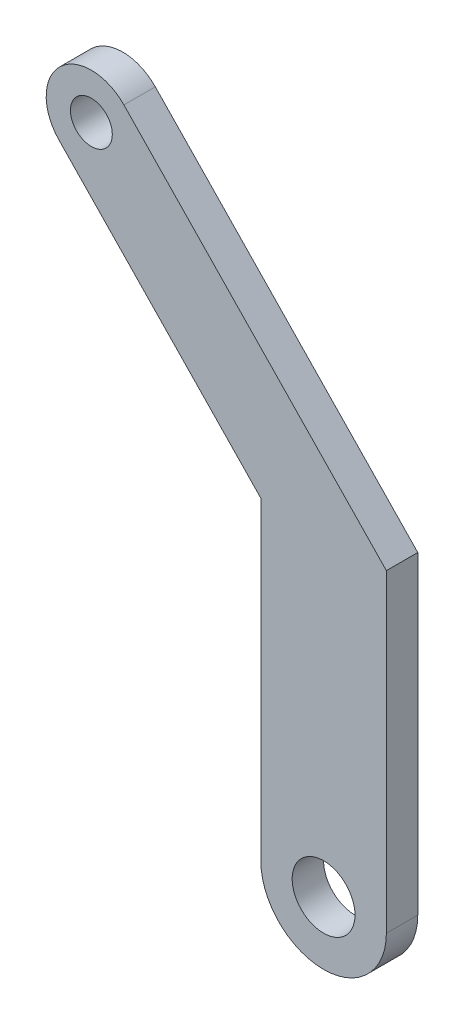
ISO-10303-21;
HEADER;
FILE_DESCRIPTION(('STEP AP214'),'2;1');
FILE_NAME('part.step','',(''),(''),'','','');
FILE_SCHEMA(('AUTOMOTIVE_DESIGN { 1 0 10303 214 1 1 1 1 }'));
ENDSEC;
DATA;
#1=APPLICATION_CONTEXT('core data for automotive mechanical design processes');
#2=APPLICATION_PROTOCOL_DEFINITION('international standard','automotive_design',2000,#1);
#3=PRODUCT_CONTEXT('',#1,'mechanical');
#4=PRODUCT('Part','Part','',(#3));
#5=PRODUCT_RELATED_PRODUCT_CATEGORY('part','',(#4));
#6=PRODUCT_DEFINITION_FORMATION('','',#4);
#7=PRODUCT_DEFINITION_CONTEXT('part definition',#1,'design');
#8=PRODUCT_DEFINITION('design','',#6,#7);
#9=PRODUCT_DEFINITION_SHAPE('','',#8);
#10=(LENGTH_UNIT() NAMED_UNIT(*) SI_UNIT(.MILLI.,.METRE.));
#11=(NAMED_UNIT(*) PLANE_ANGLE_UNIT() SI_UNIT($,.RADIAN.));
#12=(NAMED_UNIT(*) SI_UNIT($,.STERADIAN.) SOLID_ANGLE_UNIT());
#13=UNCERTAINTY_MEASURE_WITH_UNIT(LENGTH_MEASURE(1.E-05),#10,'distance_accuracy_value','');
#14=(GEOMETRIC_REPRESENTATION_CONTEXT(3) GLOBAL_UNCERTAINTY_ASSIGNED_CONTEXT((#13)) GLOBAL_UNIT_ASSIGNED_CONTEXT((#10,
#11,#12)) REPRESENTATION_CONTEXT('',''));
#15=CARTESIAN_POINT('',(0.,0.,0.));
#16=DIRECTION('',(0.,0.,1.));
#17=DIRECTION('',(1.,0.,0.));
#18=AXIS2_PLACEMENT_3D('',#15,#16,#17);
#19=CARTESIAN_POINT('',(16.6277165820643,0.,15.));
#20=DIRECTION('',(0.,0.,1.));
#21=DIRECTION('',(1.,0.,0.));
#22=AXIS2_PLACEMENT_3D('',#19,#20,#21);
#23=PLANE('',#22);
#24=CARTESIAN_POINT('',(16.6277165820643,0.,15.));
#25=DIRECTION('',(0.,0.,1.));
#26=DIRECTION('',(1.,0.,0.));
#27=AXIS2_PLACEMENT_3D('',#24,#25,#26);
#28=CIRCLE('',#27,15.);
#29=CARTESIAN_POINT('',(31.6277165820643,0.,15.));
#30=VERTEX_POINT('',#29);
#31=EDGE_CURVE('E120',#30,#30,#28,.T.);
#32=ORIENTED_EDGE('',*,*,#31,.F.);
#33=EDGE_LOOP('',(#32));
#34=FACE_BOUND('',#33,.T.);
#35=CARTESIAN_POINT('',(16.6277165820643,0.,15.));
#36=DIRECTION('',(0.,0.,1.));
#37=DIRECTION('',(1.,0.,0.));
#38=AXIS2_PLACEMENT_3D('',#35,#36,#37);
#39=CIRCLE('',#38,30.);
#40=CARTESIAN_POINT('',(-13.3722834179357,0.,15.));
#41=VERTEX_POINT('',#40);
#42=CARTESIAN_POINT('',(46.6277165820643,0.,15.));
#43=VERTEX_POINT('',#42);
#44=EDGE_CURVE('E127',#41,#43,#39,.T.);
#45=ORIENTED_EDGE('',*,*,#44,.T.);
#46=DIRECTION('',(0.,1.,0.));
#47=VECTOR('',#46,1.);
#48=CARTESIAN_POINT('',(46.6277165820643,0.,15.));
#49=LINE('',#48,#47);
#50=CARTESIAN_POINT('',(46.6277165820643,150.,15.));
#51=VERTEX_POINT('',#50);
#52=EDGE_CURVE('E85',#43,#51,#49,.T.);
#53=ORIENTED_EDGE('',*,*,#52,.T.);
#54=DIRECTION('',(-0.694288083536094,0.719697198174189,0.));
#55=VECTOR('',#54,1.);
#56=CARTESIAN_POINT('',(46.6277165820643,150.,15.));
#57=LINE('',#56,#55);
#58=CARTESIAN_POINT('',(-78.7639115022894,279.980631306799,15.));
#59=VERTEX_POINT('',#58);
#60=EDGE_CURVE('E98',#51,#59,#57,.T.);
#61=ORIENTED_EDGE('',*,*,#60,.T.);
#62=CARTESIAN_POINT('',(-94.3028332140828,264.9903156534,15.));
#63=DIRECTION('',(0.,0.,1.));
#64=DIRECTION('',(1.,0.,0.));
#65=AXIS2_PLACEMENT_3D('',#62,#63,#64);
#66=CIRCLE('',#65,21.5909159452257);
#67=CARTESIAN_POINT('',(-109.841754925876,250.,15.));
#68=VERTEX_POINT('',#67);
#69=EDGE_CURVE('E92',#59,#68,#66,.T.);
#70=ORIENTED_EDGE('',*,*,#69,.T.);
#71=DIRECTION('',(0.694288083536094,-0.719697198174189,0.));
#72=VECTOR('',#71,1.);
#73=CARTESIAN_POINT('',(-13.3722834179357,150.,15.));
#74=LINE('',#73,#72);
#75=CARTESIAN_POINT('',(-13.3722834179357,150.,15.));
#76=VERTEX_POINT('',#75);
#77=EDGE_CURVE('E96',#68,#76,#74,.T.);
#78=ORIENTED_EDGE('',*,*,#77,.T.);
#79=DIRECTION('',(0.,-1.,0.));
#80=VECTOR('',#79,1.);
#81=CARTESIAN_POINT('',(-13.3722834179357,0.,15.));
#82=LINE('',#81,#80);
#83=EDGE_CURVE('E48',#76,#41,#82,.T.);
#84=ORIENTED_EDGE('',*,*,#83,.T.);
#85=EDGE_LOOP('',(#45,#53,#61,#70,#78,#84));
#86=FACE_BOUND('',#85,.T.);
#87=CARTESIAN_POINT('',(-94.3028332140828,264.9903156534,15.));
#88=DIRECTION('',(0.,0.,1.));
#89=DIRECTION('',(1.,0.,0.));
#90=AXIS2_PLACEMENT_3D('',#87,#88,#89);
#91=CIRCLE('',#90,10.);
#92=CARTESIAN_POINT('',(-84.3028332140828,264.9903156534,15.));
#93=VERTEX_POINT('',#92);
#94=EDGE_CURVE('E170',#93,#93,#91,.T.);
#95=ORIENTED_EDGE('',*,*,#94,.F.);
#96=EDGE_LOOP('',(#95));
#97=FACE_BOUND('',#96,.T.);
#98=ADVANCED_FACE('F31',(#34,#86,#97),#23,.T.);
#99=CARTESIAN_POINT('',(16.6277165820643,0.,0.));
#100=DIRECTION('',(0.,0.,1.));
#101=DIRECTION('',(1.,0.,0.));
#102=AXIS2_PLACEMENT_3D('',#99,#100,#101);
#103=PLANE('',#102);
#104=CARTESIAN_POINT('',(16.6277165820643,0.,0.));
#105=DIRECTION('',(0.,0.,1.));
#106=DIRECTION('',(1.,0.,0.));
#107=AXIS2_PLACEMENT_3D('',#104,#105,#106);
#108=CIRCLE('',#107,15.);
#109=CARTESIAN_POINT('',(31.6277165820643,0.,0.));
#110=VERTEX_POINT('',#109);
#111=EDGE_CURVE('E175',#110,#110,#108,.T.);
#112=ORIENTED_EDGE('',*,*,#111,.T.);
#113=EDGE_LOOP('',(#112));
#114=FACE_BOUND('',#113,.T.);
#115=CARTESIAN_POINT('',(16.6277165820643,0.,0.));
#116=DIRECTION('',(0.,0.,1.));
#117=DIRECTION('',(1.,0.,0.));
#118=AXIS2_PLACEMENT_3D('',#115,#116,#117);
#119=CIRCLE('',#118,30.);
#120=CARTESIAN_POINT('',(-13.3722834179357,0.,0.));
#121=VERTEX_POINT('',#120);
#122=CARTESIAN_POINT('',(46.6277165820643,0.,0.));
#123=VERTEX_POINT('',#122);
#124=EDGE_CURVE('E116',#121,#123,#119,.T.);
#125=ORIENTED_EDGE('',*,*,#124,.F.);
#126=DIRECTION('',(0.,-1.,0.));
#127=VECTOR('',#126,1.);
#128=CARTESIAN_POINT('',(-13.3722834179357,0.,0.));
#129=LINE('',#128,#127);
#130=CARTESIAN_POINT('',(-13.3722834179357,150.,0.));
#131=VERTEX_POINT('',#130);
#132=EDGE_CURVE('E77',#131,#121,#129,.T.);
#133=ORIENTED_EDGE('',*,*,#132,.F.);
#134=DIRECTION('',(0.694288083536094,-0.719697198174189,0.));
#135=VECTOR('',#134,1.);
#136=CARTESIAN_POINT('',(-13.3722834179357,150.,0.));
#137=LINE('',#136,#135);
#138=CARTESIAN_POINT('',(-109.841754925876,250.,0.));
#139=VERTEX_POINT('',#138);
#140=EDGE_CURVE('E71',#139,#131,#137,.T.);
#141=ORIENTED_EDGE('',*,*,#140,.F.);
#142=CARTESIAN_POINT('',(-94.3028332140828,264.9903156534,0.));
#143=DIRECTION('',(0.,0.,1.));
#144=DIRECTION('',(1.,0.,0.));
#145=AXIS2_PLACEMENT_3D('',#142,#143,#144);
#146=CIRCLE('',#145,21.5909159452257);
#147=CARTESIAN_POINT('',(-78.7639115022894,279.980631306799,0.));
#148=VERTEX_POINT('',#147);
#149=EDGE_CURVE('E106',#148,#139,#146,.T.);
#150=ORIENTED_EDGE('',*,*,#149,.F.);
#151=DIRECTION('',(-0.694288083536094,0.719697198174189,0.));
#152=VECTOR('',#151,1.);
#153=CARTESIAN_POINT('',(46.6277165820643,150.,0.));
#154=LINE('',#153,#152);
#155=CARTESIAN_POINT('',(46.6277165820643,150.,0.));
#156=VERTEX_POINT('',#155);
#157=EDGE_CURVE('E122',#156,#148,#154,.T.);
#158=ORIENTED_EDGE('',*,*,#157,.F.);
#159=DIRECTION('',(0.,1.,0.));
#160=VECTOR('',#159,1.);
#161=CARTESIAN_POINT('',(46.6277165820643,0.,0.));
#162=LINE('',#161,#160);
#163=EDGE_CURVE('E119',#123,#156,#162,.T.);
#164=ORIENTED_EDGE('',*,*,#163,.F.);
#165=EDGE_LOOP('',(#125,#133,#141,#150,#158,#164));
#166=FACE_BOUND('',#165,.T.);
#167=CARTESIAN_POINT('',(-94.3028332140828,264.9903156534,0.));
#168=DIRECTION('',(0.,0.,1.));
#169=DIRECTION('',(1.,0.,0.));
#170=AXIS2_PLACEMENT_3D('',#167,#168,#169);
#171=CIRCLE('',#170,10.);
#172=CARTESIAN_POINT('',(-84.3028332140828,264.9903156534,0.));
#173=VERTEX_POINT('',#172);
#174=EDGE_CURVE('E173',#173,#173,#171,.T.);
#175=ORIENTED_EDGE('',*,*,#174,.T.);
#176=EDGE_LOOP('',(#175));
#177=FACE_BOUND('',#176,.T.);
#178=ADVANCED_FACE('F136',(#114,#166,#177),#103,.F.);
#179=CARTESIAN_POINT('',(16.6277165820643,0.,15.));
#180=DIRECTION('',(0.,0.,-1.));
#181=DIRECTION('',(-1.,0.,0.));
#182=AXIS2_PLACEMENT_3D('',#179,#180,#181);
#183=CYLINDRICAL_SURFACE('',#182,30.);
#184=ORIENTED_EDGE('',*,*,#124,.T.);
#185=DIRECTION('',(0.,0.,-1.));
#186=VECTOR('',#185,1.);
#187=CARTESIAN_POINT('',(46.6277165820643,0.,15.));
#188=LINE('',#187,#186);
#189=EDGE_CURVE('E11',#43,#123,#188,.T.);
#190=ORIENTED_EDGE('',*,*,#189,.F.);
#191=ORIENTED_EDGE('',*,*,#44,.F.);
#192=DIRECTION('',(0.,0.,-1.));
#193=VECTOR('',#192,1.);
#194=CARTESIAN_POINT('',(-13.3722834179357,0.,15.));
#195=LINE('',#194,#193);
#196=EDGE_CURVE('E112',#41,#121,#195,.T.);
#197=ORIENTED_EDGE('',*,*,#196,.T.);
#198=EDGE_LOOP('',(#184,#190,#191,#197));
#199=FACE_BOUND('',#198,.T.);
#200=ADVANCED_FACE('F33',(#199),#183,.T.);
#201=CARTESIAN_POINT('',(46.6277165820643,0.,15.));
#202=DIRECTION('',(-1.,0.,0.));
#203=DIRECTION('',(0.,-1.,0.));
#204=AXIS2_PLACEMENT_3D('',#201,#202,#203);
#205=PLANE('',#204);
#206=ORIENTED_EDGE('',*,*,#163,.T.);
#207=DIRECTION('',(0.,0.,-1.));
#208=VECTOR('',#207,1.);
#209=CARTESIAN_POINT('',(46.6277165820643,150.,15.));
#210=LINE('',#209,#208);
#211=EDGE_CURVE('E40',#51,#156,#210,.T.);
#212=ORIENTED_EDGE('',*,*,#211,.F.);
#213=ORIENTED_EDGE('',*,*,#52,.F.);
#214=ORIENTED_EDGE('',*,*,#189,.T.);
#215=EDGE_LOOP('',(#206,#212,#213,#214));
#216=FACE_BOUND('',#215,.T.);
#217=ADVANCED_FACE('F216',(#216),#205,.F.);
#218=CARTESIAN_POINT('',(46.6277165820643,150.,15.));
#219=DIRECTION('',(-0.719697198174189,-0.694288083536094,0.));
#220=DIRECTION('',(0.694288083536094,-0.719697198174189,0.));
#221=AXIS2_PLACEMENT_3D('',#218,#219,#220);
#222=PLANE('',#221);
#223=ORIENTED_EDGE('',*,*,#157,.T.);
#224=DIRECTION('',(0.,0.,-1.));
#225=VECTOR('',#224,1.);
#226=CARTESIAN_POINT('',(-78.7639115022894,279.980631306799,15.));
#227=LINE('',#226,#225);
#228=EDGE_CURVE('E107',#59,#148,#227,.T.);
#229=ORIENTED_EDGE('',*,*,#228,.F.);
#230=ORIENTED_EDGE('',*,*,#60,.F.);
#231=ORIENTED_EDGE('',*,*,#211,.T.);
#232=EDGE_LOOP('',(#223,#229,#230,#231));
#233=FACE_BOUND('',#232,.T.);
#234=ADVANCED_FACE('F133',(#233),#222,.F.);
#235=CARTESIAN_POINT('',(-94.3028332140828,264.9903156534,15.));
#236=DIRECTION('',(0.,0.,-1.));
#237=DIRECTION('',(-1.,0.,0.));
#238=AXIS2_PLACEMENT_3D('',#235,#236,#237);
#239=CYLINDRICAL_SURFACE('',#238,21.5909159452257);
#240=ORIENTED_EDGE('',*,*,#149,.T.);
#241=DIRECTION('',(0.,0.,-1.));
#242=VECTOR('',#241,1.);
#243=CARTESIAN_POINT('',(-109.841754925876,250.,15.));
#244=LINE('',#243,#242);
#245=EDGE_CURVE('E103',#68,#139,#244,.T.);
#246=ORIENTED_EDGE('',*,*,#245,.F.);
#247=ORIENTED_EDGE('',*,*,#69,.F.);
#248=ORIENTED_EDGE('',*,*,#228,.T.);
#249=EDGE_LOOP('',(#240,#246,#247,#248));
#250=FACE_BOUND('',#249,.T.);
#251=ADVANCED_FACE('F104',(#250),#239,.T.);
#252=CARTESIAN_POINT('',(-13.3722834179357,150.,15.));
#253=DIRECTION('',(0.719697198174189,0.694288083536094,0.));
#254=DIRECTION('',(-0.694288083536094,0.719697198174189,0.));
#255=AXIS2_PLACEMENT_3D('',#252,#253,#254);
#256=PLANE('',#255);
#257=ORIENTED_EDGE('',*,*,#140,.T.);
#258=DIRECTION('',(0.,0.,-1.));
#259=VECTOR('',#258,1.);
#260=CARTESIAN_POINT('',(-13.3722834179357,150.,15.));
#261=LINE('',#260,#259);
#262=EDGE_CURVE('E108',#76,#131,#261,.T.);
#263=ORIENTED_EDGE('',*,*,#262,.F.);
#264=ORIENTED_EDGE('',*,*,#77,.F.);
#265=ORIENTED_EDGE('',*,*,#245,.T.);
#266=EDGE_LOOP('',(#257,#263,#264,#265));
#267=FACE_BOUND('',#266,.T.);
#268=ADVANCED_FACE('F110',(#267),#256,.F.);
#269=CARTESIAN_POINT('',(-13.3722834179357,0.,15.));
#270=DIRECTION('',(1.,0.,0.));
#271=DIRECTION('',(0.,0.,-1.));
#272=AXIS2_PLACEMENT_3D('',#269,#270,#271);
#273=PLANE('',#272);
#274=ORIENTED_EDGE('',*,*,#132,.T.);
#275=ORIENTED_EDGE('',*,*,#196,.F.);
#276=ORIENTED_EDGE('',*,*,#83,.F.);
#277=ORIENTED_EDGE('',*,*,#262,.T.);
#278=EDGE_LOOP('',(#274,#275,#276,#277));
#279=FACE_BOUND('',#278,.T.);
#280=ADVANCED_FACE('F141',(#279),#273,.F.);
#281=CARTESIAN_POINT('',(16.6277165820643,0.,15.));
#282=DIRECTION('',(0.,0.,-1.));
#283=DIRECTION('',(-1.,0.,0.));
#284=AXIS2_PLACEMENT_3D('',#281,#282,#283);
#285=CYLINDRICAL_SURFACE('',#284,15.);
#286=ORIENTED_EDGE('',*,*,#31,.T.);
#287=EDGE_LOOP('',(#286));
#288=FACE_BOUND('',#287,.T.);
#289=ORIENTED_EDGE('',*,*,#111,.F.);
#290=EDGE_LOOP('',(#289));
#291=FACE_BOUND('',#290,.T.);
#292=ADVANCED_FACE('F143',(#288,#291),#285,.F.);
#293=CARTESIAN_POINT('',(-94.3028332140828,264.9903156534,15.));
#294=DIRECTION('',(0.,0.,-1.));
#295=DIRECTION('',(-1.,0.,0.));
#296=AXIS2_PLACEMENT_3D('',#293,#294,#295);
#297=CYLINDRICAL_SURFACE('',#296,10.);
#298=ORIENTED_EDGE('',*,*,#94,.T.);
#299=EDGE_LOOP('',(#298));
#300=FACE_BOUND('',#299,.T.);
#301=ORIENTED_EDGE('',*,*,#174,.F.);
#302=EDGE_LOOP('',(#301));
#303=FACE_BOUND('',#302,.T.);
#304=ADVANCED_FACE('F149',(#300,#303),#297,.F.);
#305=CLOSED_SHELL('',(#98,#178,#200,#217,#234,#251,#268,#280,#292,#304));
#306=MANIFOLD_SOLID_BREP('B2',#305);
#307=ADVANCED_BREP_SHAPE_REPRESENTATION('',(#18,#306),#14);
#308=SHAPE_DEFINITION_REPRESENTATION(#9,#307);
ENDSEC;
END-ISO-10303-21;
